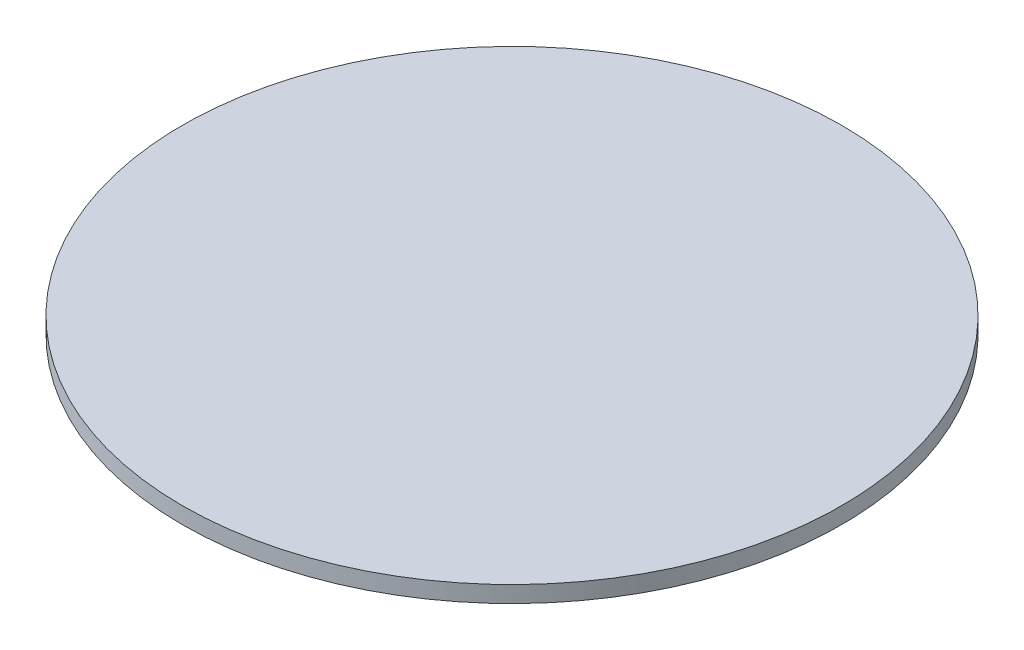
ISO-10303-21;
HEADER;
FILE_DESCRIPTION(('STEP AP214'),'2;1');
FILE_NAME('part.step','',(''),(''),'','','');
FILE_SCHEMA(('AUTOMOTIVE_DESIGN { 1 0 10303 214 1 1 1 1 }'));
ENDSEC;
DATA;
#1=APPLICATION_CONTEXT('core data for automotive mechanical design processes');
#2=APPLICATION_PROTOCOL_DEFINITION('international standard','automotive_design',2000,#1);
#3=PRODUCT_CONTEXT('',#1,'mechanical');
#4=PRODUCT('Part','Part','',(#3));
#5=PRODUCT_RELATED_PRODUCT_CATEGORY('part','',(#4));
#6=PRODUCT_DEFINITION_FORMATION('','',#4);
#7=PRODUCT_DEFINITION_CONTEXT('part definition',#1,'design');
#8=PRODUCT_DEFINITION('design','',#6,#7);
#9=PRODUCT_DEFINITION_SHAPE('','',#8);
#10=(LENGTH_UNIT() NAMED_UNIT(*) SI_UNIT(.MILLI.,.METRE.));
#11=(NAMED_UNIT(*) PLANE_ANGLE_UNIT() SI_UNIT($,.RADIAN.));
#12=(NAMED_UNIT(*) SI_UNIT($,.STERADIAN.) SOLID_ANGLE_UNIT());
#13=UNCERTAINTY_MEASURE_WITH_UNIT(LENGTH_MEASURE(1.E-05),#10,'distance_accuracy_value','');
#14=(GEOMETRIC_REPRESENTATION_CONTEXT(3) GLOBAL_UNCERTAINTY_ASSIGNED_CONTEXT((#13)) GLOBAL_UNIT_ASSIGNED_CONTEXT((#10,
#11,#12)) REPRESENTATION_CONTEXT('',''));
#15=CARTESIAN_POINT('',(0.,0.,0.));
#16=DIRECTION('',(0.,0.,1.));
#17=DIRECTION('',(1.,0.,0.));
#18=AXIS2_PLACEMENT_3D('',#15,#16,#17);
#19=CARTESIAN_POINT('',(0.,1.,0.));
#20=DIRECTION('',(0.,-1.,0.));
#21=DIRECTION('',(0.,0.,-1.));
#22=AXIS2_PLACEMENT_3D('',#19,#20,#21);
#23=CYLINDRICAL_SURFACE('',#22,20.);
#24=CARTESIAN_POINT('',(0.,1.,0.));
#25=DIRECTION('',(0.,1.,0.));
#26=DIRECTION('',(0.,0.,1.));
#27=AXIS2_PLACEMENT_3D('',#24,#25,#26);
#28=CIRCLE('',#27,20.);
#29=CARTESIAN_POINT('',(0.,1.,20.));
#30=VERTEX_POINT('',#29);
#31=EDGE_CURVE('E10',#30,#30,#28,.T.);
#32=ORIENTED_EDGE('',*,*,#31,.F.);
#33=EDGE_LOOP('',(#32));
#34=FACE_BOUND('',#33,.T.);
#35=CARTESIAN_POINT('',(0.,0.,0.));
#36=DIRECTION('',(0.,1.,0.));
#37=DIRECTION('',(0.,0.,1.));
#38=AXIS2_PLACEMENT_3D('',#35,#36,#37);
#39=CIRCLE('',#38,20.);
#40=CARTESIAN_POINT('',(0.,0.,20.));
#41=VERTEX_POINT('',#40);
#42=EDGE_CURVE('E37',#41,#41,#39,.T.);
#43=ORIENTED_EDGE('',*,*,#42,.T.);
#44=EDGE_LOOP('',(#43));
#45=FACE_BOUND('',#44,.T.);
#46=ADVANCED_FACE('F34',(#34,#45),#23,.T.);
#47=CARTESIAN_POINT('',(0.,1.,0.));
#48=DIRECTION('',(0.,1.,0.));
#49=DIRECTION('',(0.,0.,1.));
#50=AXIS2_PLACEMENT_3D('',#47,#48,#49);
#51=PLANE('',#50);
#52=ORIENTED_EDGE('',*,*,#31,.T.);
#53=EDGE_LOOP('',(#52));
#54=FACE_BOUND('',#53,.T.);
#55=ADVANCED_FACE('F49',(#54),#51,.T.);
#56=CARTESIAN_POINT('',(0.,0.,0.));
#57=DIRECTION('',(0.,1.,0.));
#58=DIRECTION('',(0.,0.,1.));
#59=AXIS2_PLACEMENT_3D('',#56,#57,#58);
#60=PLANE('',#59);
#61=ORIENTED_EDGE('',*,*,#42,.F.);
#62=EDGE_LOOP('',(#61));
#63=FACE_BOUND('',#62,.T.);
#64=ADVANCED_FACE('F47',(#63),#60,.F.);
#65=CLOSED_SHELL('',(#46,#55,#64));
#66=MANIFOLD_SOLID_BREP('B2',#65);
#67=ADVANCED_BREP_SHAPE_REPRESENTATION('',(#18,#66),#14);
#68=SHAPE_DEFINITION_REPRESENTATION(#9,#67);
ENDSEC;
END-ISO-10303-21;
